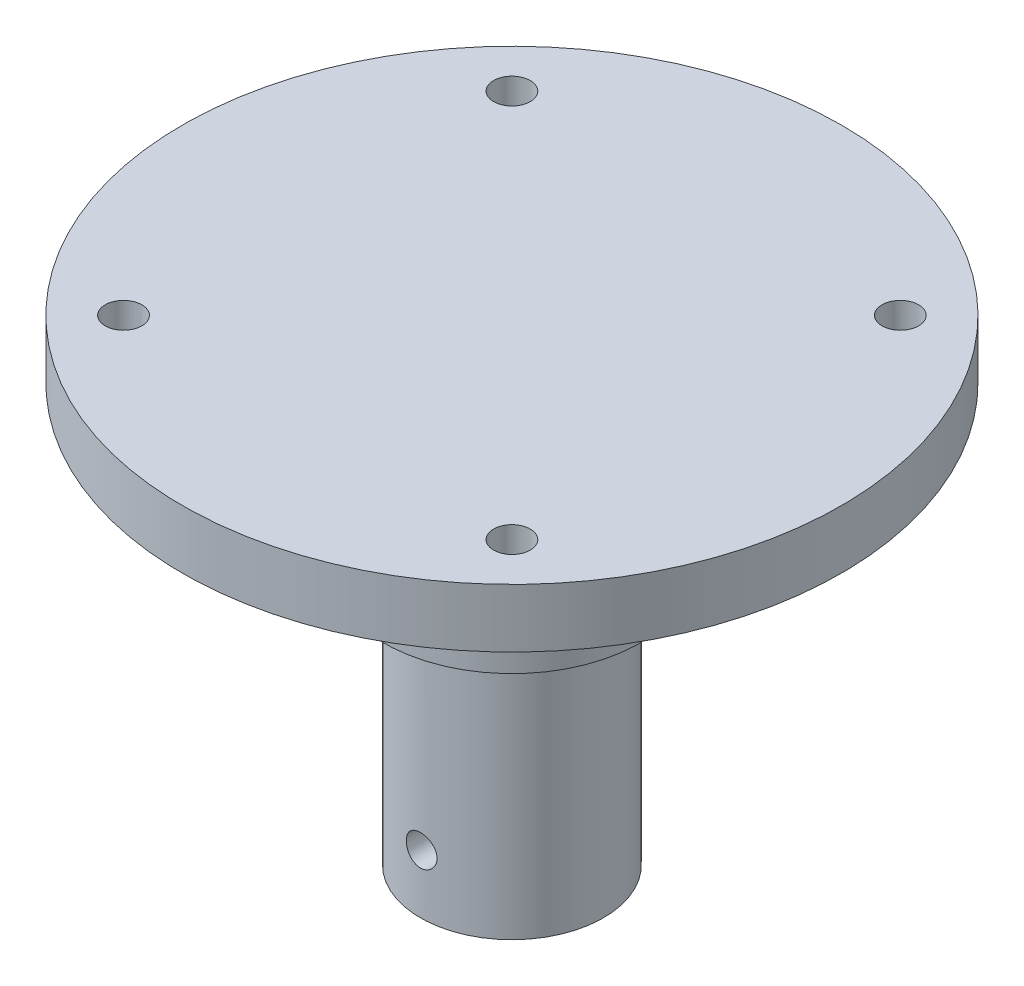
ISO-10303-21;
HEADER;
FILE_DESCRIPTION(('STEP AP214'),'2;1');
FILE_NAME('part.step','',(''),(''),'','','');
FILE_SCHEMA(('AUTOMOTIVE_DESIGN { 1 0 10303 214 1 1 1 1 }'));
ENDSEC;
DATA;
#1=APPLICATION_CONTEXT('core data for automotive mechanical design processes');
#2=APPLICATION_PROTOCOL_DEFINITION('international standard','automotive_design',2000,#1);
#3=PRODUCT_CONTEXT('',#1,'mechanical');
#4=PRODUCT('Part','Part','',(#3));
#5=PRODUCT_RELATED_PRODUCT_CATEGORY('part','',(#4));
#6=PRODUCT_DEFINITION_FORMATION('','',#4);
#7=PRODUCT_DEFINITION_CONTEXT('part definition',#1,'design');
#8=PRODUCT_DEFINITION('design','',#6,#7);
#9=PRODUCT_DEFINITION_SHAPE('','',#8);
#10=(LENGTH_UNIT() NAMED_UNIT(*) SI_UNIT(.MILLI.,.METRE.));
#11=(NAMED_UNIT(*) PLANE_ANGLE_UNIT() SI_UNIT($,.RADIAN.));
#12=(NAMED_UNIT(*) SI_UNIT($,.STERADIAN.) SOLID_ANGLE_UNIT());
#13=UNCERTAINTY_MEASURE_WITH_UNIT(LENGTH_MEASURE(1.E-05),#10,'distance_accuracy_value','');
#14=(GEOMETRIC_REPRESENTATION_CONTEXT(3) GLOBAL_UNCERTAINTY_ASSIGNED_CONTEXT((#13)) GLOBAL_UNIT_ASSIGNED_CONTEXT((#10,
#11,#12)) REPRESENTATION_CONTEXT('',''));
#15=CARTESIAN_POINT('',(0.,0.,0.));
#16=DIRECTION('',(0.,0.,1.));
#17=DIRECTION('',(1.,0.,0.));
#18=AXIS2_PLACEMENT_3D('',#15,#16,#17);
#19=CARTESIAN_POINT('',(0.,0.,0.));
#20=DIRECTION('',(0.,-1.,0.));
#21=DIRECTION('',(0.,0.,-1.));
#22=AXIS2_PLACEMENT_3D('',#19,#20,#21);
#23=CYLINDRICAL_SURFACE('',#22,17.5);
#24=CARTESIAN_POINT('',(0.,57.,0.));
#25=DIRECTION('',(0.,-1.,0.));
#26=DIRECTION('',(0.,0.,-1.));
#27=AXIS2_PLACEMENT_3D('',#24,#25,#26);
#28=CIRCLE('',#27,17.5);
#29=CARTESIAN_POINT('',(0.,57.,-17.5));
#30=VERTEX_POINT('',#29);
#31=EDGE_CURVE('E10',#30,#30,#28,.T.);
#32=ORIENTED_EDGE('',*,*,#31,.T.);
#33=EDGE_LOOP('',(#32));
#34=FACE_BOUND('',#33,.T.);
#35=CARTESIAN_POINT('',(0.,35.,0.));
#36=DIRECTION('',(0.,-1.,0.));
#37=DIRECTION('',(0.,0.,-1.));
#38=AXIS2_PLACEMENT_3D('',#35,#36,#37);
#39=CIRCLE('',#38,17.5);
#40=CARTESIAN_POINT('',(0.,35.,-17.5));
#41=VERTEX_POINT('',#40);
#42=EDGE_CURVE('E167',#41,#41,#39,.T.);
#43=ORIENTED_EDGE('',*,*,#42,.F.);
#44=EDGE_LOOP('',(#43));
#45=FACE_BOUND('',#44,.T.);
#46=ADVANCED_FACE('F30',(#34,#45),#23,.T.);
#47=CARTESIAN_POINT('',(17.5,57.,0.));
#48=DIRECTION('',(0.,-1.,0.));
#49=DIRECTION('',(0.,0.,-1.));
#50=AXIS2_PLACEMENT_3D('',#47,#48,#49);
#51=PLANE('',#50);
#52=CARTESIAN_POINT('',(26.5165042944955,57.,-26.5165042944955));
#53=DIRECTION('',(0.,-1.,0.));
#54=DIRECTION('',(0.,0.,-1.));
#55=AXIS2_PLACEMENT_3D('',#52,#53,#54);
#56=CIRCLE('',#55,2.49999999999999);
#57=CARTESIAN_POINT('',(26.5165042944955,57.,-29.0165042944955));
#58=VERTEX_POINT('',#57);
#59=EDGE_CURVE('E116',#58,#58,#56,.T.);
#60=ORIENTED_EDGE('',*,*,#59,.F.);
#61=EDGE_LOOP('',(#60));
#62=FACE_BOUND('',#61,.T.);
#63=CARTESIAN_POINT('',(-26.5165042944955,57.,26.5165042944955));
#64=DIRECTION('',(0.,-1.,0.));
#65=DIRECTION('',(0.,0.,-1.));
#66=AXIS2_PLACEMENT_3D('',#63,#64,#65);
#67=CIRCLE('',#66,2.49999999999999);
#68=CARTESIAN_POINT('',(-26.5165042944955,57.,24.0165042944955));
#69=VERTEX_POINT('',#68);
#70=EDGE_CURVE('E129',#69,#69,#67,.T.);
#71=ORIENTED_EDGE('',*,*,#70,.F.);
#72=EDGE_LOOP('',(#71));
#73=FACE_BOUND('',#72,.T.);
#74=CARTESIAN_POINT('',(-26.5165042944955,57.,-26.5165042944955));
#75=DIRECTION('',(0.,-1.,0.));
#76=DIRECTION('',(0.,0.,-1.));
#77=AXIS2_PLACEMENT_3D('',#74,#75,#76);
#78=CIRCLE('',#77,2.49999999999999);
#79=CARTESIAN_POINT('',(-26.5165042944955,57.,-29.0165042944955));
#80=VERTEX_POINT('',#79);
#81=EDGE_CURVE('E135',#80,#80,#78,.T.);
#82=ORIENTED_EDGE('',*,*,#81,.F.);
#83=EDGE_LOOP('',(#82));
#84=FACE_BOUND('',#83,.T.);
#85=CARTESIAN_POINT('',(26.5165042944955,57.,26.5165042944955));
#86=DIRECTION('',(0.,-1.,0.));
#87=DIRECTION('',(0.,0.,-1.));
#88=AXIS2_PLACEMENT_3D('',#85,#86,#87);
#89=CIRCLE('',#88,2.49999999999999);
#90=CARTESIAN_POINT('',(26.5165042944955,57.,24.0165042944955));
#91=VERTEX_POINT('',#90);
#92=EDGE_CURVE('E141',#91,#91,#89,.T.);
#93=ORIENTED_EDGE('',*,*,#92,.F.);
#94=EDGE_LOOP('',(#93));
#95=FACE_BOUND('',#94,.T.);
#96=CARTESIAN_POINT('',(0.,57.,0.));
#97=DIRECTION('',(0.,-1.,0.));
#98=DIRECTION('',(0.,0.,-1.));
#99=AXIS2_PLACEMENT_3D('',#96,#97,#98);
#100=CIRCLE('',#99,45.);
#101=CARTESIAN_POINT('',(0.,57.,-45.));
#102=VERTEX_POINT('',#101);
#103=EDGE_CURVE('E42',#102,#102,#100,.T.);
#104=ORIENTED_EDGE('',*,*,#103,.T.);
#105=EDGE_LOOP('',(#104));
#106=FACE_BOUND('',#105,.T.);
#107=ORIENTED_EDGE('',*,*,#31,.F.);
#108=EDGE_LOOP('',(#107));
#109=FACE_BOUND('',#108,.T.);
#110=ADVANCED_FACE('F79',(#62,#73,#84,#95,#106,#109),#51,.T.);
#111=CARTESIAN_POINT('',(0.,0.,0.));
#112=DIRECTION('',(0.,-1.,0.));
#113=DIRECTION('',(0.,0.,-1.));
#114=AXIS2_PLACEMENT_3D('',#111,#112,#113);
#115=CYLINDRICAL_SURFACE('',#114,45.);
#116=CARTESIAN_POINT('',(0.,65.,0.));
#117=DIRECTION('',(0.,-1.,0.));
#118=DIRECTION('',(0.,0.,-1.));
#119=AXIS2_PLACEMENT_3D('',#116,#117,#118);
#120=CIRCLE('',#119,45.);
#121=CARTESIAN_POINT('',(0.,65.,-45.));
#122=VERTEX_POINT('',#121);
#123=EDGE_CURVE('E47',#122,#122,#120,.T.);
#124=ORIENTED_EDGE('',*,*,#123,.T.);
#125=EDGE_LOOP('',(#124));
#126=FACE_BOUND('',#125,.T.);
#127=ORIENTED_EDGE('',*,*,#103,.F.);
#128=EDGE_LOOP('',(#127));
#129=FACE_BOUND('',#128,.T.);
#130=ADVANCED_FACE('F83',(#126,#129),#115,.T.);
#131=CARTESIAN_POINT('',(45.,65.,0.));
#132=DIRECTION('',(0.,1.,0.));
#133=DIRECTION('',(0.,0.,1.));
#134=AXIS2_PLACEMENT_3D('',#131,#132,#133);
#135=PLANE('',#134);
#136=CARTESIAN_POINT('',(26.5165042944955,65.,-26.5165042944955));
#137=DIRECTION('',(0.,1.,0.));
#138=DIRECTION('',(0.,0.,1.));
#139=AXIS2_PLACEMENT_3D('',#136,#137,#138);
#140=CIRCLE('',#139,2.49999999999999);
#141=CARTESIAN_POINT('',(26.5165042944955,65.,-24.0165042944955));
#142=VERTEX_POINT('',#141);
#143=EDGE_CURVE('E119',#142,#142,#140,.T.);
#144=ORIENTED_EDGE('',*,*,#143,.F.);
#145=EDGE_LOOP('',(#144));
#146=FACE_BOUND('',#145,.T.);
#147=CARTESIAN_POINT('',(-26.5165042944955,65.,26.5165042944955));
#148=DIRECTION('',(0.,1.,0.));
#149=DIRECTION('',(0.,0.,1.));
#150=AXIS2_PLACEMENT_3D('',#147,#148,#149);
#151=CIRCLE('',#150,2.49999999999999);
#152=CARTESIAN_POINT('',(-26.5165042944955,65.,29.0165042944955));
#153=VERTEX_POINT('',#152);
#154=EDGE_CURVE('E122',#153,#153,#151,.T.);
#155=ORIENTED_EDGE('',*,*,#154,.F.);
#156=EDGE_LOOP('',(#155));
#157=FACE_BOUND('',#156,.T.);
#158=CARTESIAN_POINT('',(-26.5165042944955,65.,-26.5165042944955));
#159=DIRECTION('',(0.,1.,0.));
#160=DIRECTION('',(0.,0.,1.));
#161=AXIS2_PLACEMENT_3D('',#158,#159,#160);
#162=CIRCLE('',#161,2.49999999999999);
#163=CARTESIAN_POINT('',(-26.5165042944955,65.,-24.0165042944955));
#164=VERTEX_POINT('',#163);
#165=EDGE_CURVE('E132',#164,#164,#162,.T.);
#166=ORIENTED_EDGE('',*,*,#165,.F.);
#167=EDGE_LOOP('',(#166));
#168=FACE_BOUND('',#167,.T.);
#169=CARTESIAN_POINT('',(26.5165042944955,65.,26.5165042944955));
#170=DIRECTION('',(0.,1.,0.));
#171=DIRECTION('',(0.,0.,1.));
#172=AXIS2_PLACEMENT_3D('',#169,#170,#171);
#173=CIRCLE('',#172,2.49999999999999);
#174=CARTESIAN_POINT('',(26.5165042944955,65.,29.0165042944955));
#175=VERTEX_POINT('',#174);
#176=EDGE_CURVE('E138',#175,#175,#173,.T.);
#177=ORIENTED_EDGE('',*,*,#176,.F.);
#178=EDGE_LOOP('',(#177));
#179=FACE_BOUND('',#178,.T.);
#180=ORIENTED_EDGE('',*,*,#123,.F.);
#181=EDGE_LOOP('',(#180));
#182=FACE_BOUND('',#181,.T.);
#183=ADVANCED_FACE('F90',(#146,#157,#168,#179,#182),#135,.T.);
#184=CARTESIAN_POINT('',(26.5165042944955,65.,26.5165042944955));
#185=DIRECTION('',(0.,1.,0.));
#186=DIRECTION('',(0.,0.,1.));
#187=AXIS2_PLACEMENT_3D('',#184,#185,#186);
#188=CYLINDRICAL_SURFACE('',#187,2.49999999999999);
#189=ORIENTED_EDGE('',*,*,#92,.T.);
#190=EDGE_LOOP('',(#189));
#191=FACE_BOUND('',#190,.T.);
#192=ORIENTED_EDGE('',*,*,#176,.T.);
#193=EDGE_LOOP('',(#192));
#194=FACE_BOUND('',#193,.T.);
#195=ADVANCED_FACE('F94',(#191,#194),#188,.F.);
#196=CARTESIAN_POINT('',(-26.5165042944955,65.,-26.5165042944955));
#197=DIRECTION('',(0.,1.,0.));
#198=DIRECTION('',(0.,0.,1.));
#199=AXIS2_PLACEMENT_3D('',#196,#197,#198);
#200=CYLINDRICAL_SURFACE('',#199,2.49999999999999);
#201=ORIENTED_EDGE('',*,*,#81,.T.);
#202=EDGE_LOOP('',(#201));
#203=FACE_BOUND('',#202,.T.);
#204=ORIENTED_EDGE('',*,*,#165,.T.);
#205=EDGE_LOOP('',(#204));
#206=FACE_BOUND('',#205,.T.);
#207=ADVANCED_FACE('F98',(#203,#206),#200,.F.);
#208=CARTESIAN_POINT('',(-26.5165042944955,65.,26.5165042944955));
#209=DIRECTION('',(0.,1.,0.));
#210=DIRECTION('',(0.,0.,1.));
#211=AXIS2_PLACEMENT_3D('',#208,#209,#210);
#212=CYLINDRICAL_SURFACE('',#211,2.49999999999999);
#213=ORIENTED_EDGE('',*,*,#70,.T.);
#214=EDGE_LOOP('',(#213));
#215=FACE_BOUND('',#214,.T.);
#216=ORIENTED_EDGE('',*,*,#154,.T.);
#217=EDGE_LOOP('',(#216));
#218=FACE_BOUND('',#217,.T.);
#219=ADVANCED_FACE('F102',(#215,#218),#212,.F.);
#220=CARTESIAN_POINT('',(26.5165042944955,65.,-26.5165042944955));
#221=DIRECTION('',(0.,1.,0.));
#222=DIRECTION('',(0.,0.,1.));
#223=AXIS2_PLACEMENT_3D('',#220,#221,#222);
#224=CYLINDRICAL_SURFACE('',#223,2.49999999999999);
#225=ORIENTED_EDGE('',*,*,#59,.T.);
#226=EDGE_LOOP('',(#225));
#227=FACE_BOUND('',#226,.T.);
#228=ORIENTED_EDGE('',*,*,#143,.T.);
#229=EDGE_LOOP('',(#228));
#230=FACE_BOUND('',#229,.T.);
#231=ADVANCED_FACE('F105',(#227,#230),#224,.F.);
#232=CARTESIAN_POINT('',(0.,35.,0.));
#233=DIRECTION('',(0.,-1.,0.));
#234=DIRECTION('',(0.,0.,-1.));
#235=AXIS2_PLACEMENT_3D('',#232,#233,#234);
#236=CYLINDRICAL_SURFACE('',#235,12.5);
#237=CARTESIAN_POINT('',(0.,35.,0.));
#238=DIRECTION('',(0.,-1.,0.));
#239=DIRECTION('',(0.,0.,-1.));
#240=AXIS2_PLACEMENT_3D('',#237,#238,#239);
#241=CIRCLE('',#240,12.5);
#242=CARTESIAN_POINT('',(0.,35.,-12.5));
#243=VERTEX_POINT('',#242);
#244=EDGE_CURVE('E170',#243,#243,#241,.T.);
#245=ORIENTED_EDGE('',*,*,#244,.T.);
#246=EDGE_LOOP('',(#245));
#247=FACE_BOUND('',#246,.T.);
#248=CARTESIAN_POINT('',(0.,0.,0.));
#249=DIRECTION('',(0.,-1.,0.));
#250=DIRECTION('',(0.,0.,-1.));
#251=AXIS2_PLACEMENT_3D('',#248,#249,#250);
#252=CIRCLE('',#251,12.5);
#253=CARTESIAN_POINT('',(0.,0.,-12.5));
#254=VERTEX_POINT('',#253);
#255=EDGE_CURVE('E171',#254,#254,#252,.T.);
#256=ORIENTED_EDGE('',*,*,#255,.F.);
#257=EDGE_LOOP('',(#256));
#258=FACE_BOUND('',#257,.T.);
#259=CARTESIAN_POINT('',(-2.1,8.,12.3223374405995));
#260=CARTESIAN_POINT('',(-2.09999530712857,8.11706139847949,12.3223395650367));
#261=CARTESIAN_POINT('',(-2.09017872592953,8.2341863798609,12.3240236342084));
#262=CARTESIAN_POINT('',(-2.05118940750232,8.46514903241884,12.3305716769245));
#263=CARTESIAN_POINT('',(-2.02199890673147,8.57898358662184,12.3354385686725));
#264=CARTESIAN_POINT('',(-1.94517053187237,8.79998945915861,12.3477858289215));
#265=CARTESIAN_POINT('',(-1.89754818175194,8.9071662969402,12.3552639975939));
#266=CARTESIAN_POINT('',(-1.78524674613213,9.11199727209984,12.3719886100909));
#267=CARTESIAN_POINT('',(-1.72056954414086,9.20965245940209,12.3812348586209));
#268=CARTESIAN_POINT('',(-1.57530351952462,9.39365732336604,12.4005572659454));
#269=CARTESIAN_POINT('',(-1.49457727212389,9.47989781933382,12.4106401206403));
#270=CARTESIAN_POINT('',(-1.31980166164295,9.6376767535172,12.4304401945053));
#271=CARTESIAN_POINT('',(-1.22575150451584,9.70921431487887,12.4401573918401));
#272=CARTESIAN_POINT('',(-1.02628979622167,9.83596698770096,12.4582021958376));
#273=CARTESIAN_POINT('',(-0.920812758368821,9.89108040578945,12.4665210113829));
#274=CARTESIAN_POINT('',(-0.701934758227069,9.98276658366494,12.4807572069388));
#275=CARTESIAN_POINT('',(-0.588534319920948,10.0193405681662,12.4866747455726));
#276=CARTESIAN_POINT('',(-0.358156739240033,10.072575520882,12.4953943706673));
#277=CARTESIAN_POINT('',(-0.241223099214209,10.0894199723059,12.4982251464575));
#278=CARTESIAN_POINT('',(-0.00615732912204097,10.1032883318735,12.5005508820687));
#279=CARTESIAN_POINT('',(0.111974717670046,10.1003136079088,12.5000460721071));
#280=CARTESIAN_POINT('',(0.344829212766613,10.0747710060593,12.4957802077193));
#281=CARTESIAN_POINT('',(0.45957400948303,10.0524005980241,12.4920519724506));
#282=CARTESIAN_POINT('',(0.683657725899589,9.98901266954719,12.4817947717205));
#283=CARTESIAN_POINT('',(0.792996478775861,9.94799457405855,12.4752657198895));
#284=CARTESIAN_POINT('',(1.00375076643002,9.84827986770816,12.460084682479));
#285=CARTESIAN_POINT('',(1.10512714450859,9.78950203626583,12.4514229780687));
#286=CARTESIAN_POINT('',(1.29665223163887,9.65599587096096,12.4329386941724));
#287=CARTESIAN_POINT('',(1.38680001677374,9.58126622591422,12.4231160192883));
#288=CARTESIAN_POINT('',(1.55447585819368,9.41688291402221,12.4032590212249));
#289=CARTESIAN_POINT('',(1.63183466644083,9.32705664642597,12.3932235816326));
#290=CARTESIAN_POINT('',(1.77040983518762,9.13561108413362,12.3741891286412));
#291=CARTESIAN_POINT('',(1.83162604210974,9.03399167725317,12.3651901251031));
#292=CARTESIAN_POINT('',(1.93621248583404,8.82164644535532,12.3492468068517));
#293=CARTESIAN_POINT('',(1.97956208877491,8.71091026753202,12.3423048703977));
#294=CARTESIAN_POINT('',(2.04699732452101,8.48358514548419,12.3313008514754));
#295=CARTESIAN_POINT('',(2.07108468251577,8.36699672639973,12.3272385111049));
#296=CARTESIAN_POINT('',(2.09907282104123,8.13279167801634,12.3225036043167));
#297=CARTESIAN_POINT('',(2.10321498134418,8.01520468731475,12.3217905074651));
#298=CARTESIAN_POINT('',(2.09183861336605,7.78101764565068,12.3237268410071));
#299=CARTESIAN_POINT('',(2.07632085720624,7.66441755610981,12.3263761393465));
#300=CARTESIAN_POINT('',(2.02627103609545,7.43628254934819,12.3347012885269));
#301=CARTESIAN_POINT('',(1.99186205922477,7.32471984966109,12.3403575397118));
#302=CARTESIAN_POINT('',(1.90513572637029,7.10894421596061,12.3540428027724));
#303=CARTESIAN_POINT('',(1.85281728361786,7.00473172843018,12.362071958635));
#304=CARTESIAN_POINT('',(1.73118831712496,6.80554111043399,12.3796924068664));
#305=CARTESIAN_POINT('',(1.66172324435857,6.71065860416266,12.3892976250501));
#306=CARTESIAN_POINT('',(1.50798477365039,6.53381039785657,12.4089472944051));
#307=CARTESIAN_POINT('',(1.42371031675844,6.45184562230417,12.4189917769475));
#308=CARTESIAN_POINT('',(1.24167537367212,6.30227689699609,12.4385165395491));
#309=CARTESIAN_POINT('',(1.1437816780725,6.23483400542594,12.447989728618));
#310=CARTESIAN_POINT('',(0.937913341098333,6.11735214964424,12.4651904347497));
#311=CARTESIAN_POINT('',(0.829939029987766,6.06731261551258,12.4729180089745));
#312=CARTESIAN_POINT('',(0.607450886419188,5.98630796577563,12.4857259960798));
#313=CARTESIAN_POINT('',(0.492968323022445,5.95525888533505,12.4908180461255));
#314=CARTESIAN_POINT('',(0.260321202595992,5.91284628407858,12.4978304746155));
#315=CARTESIAN_POINT('',(0.142156954448745,5.90148111634354,12.4997511184054));
#316=CARTESIAN_POINT('',(-0.0929453860710271,5.89880695297193,12.500200486709));
#317=CARTESIAN_POINT('',(-0.2098806854464,5.90725301357962,12.4987706365668));
#318=CARTESIAN_POINT('',(-0.440641970697272,5.94343134720361,12.4927643357866));
#319=CARTESIAN_POINT('',(-0.554467974665941,5.97116350796812,12.4881879034629));
#320=CARTESIAN_POINT('',(-0.775683838548143,6.04503225889227,12.4764009404282));
#321=CARTESIAN_POINT('',(-0.88308093148998,6.09114770112676,12.4691934372722));
#322=CARTESIAN_POINT('',(-1.08865103993481,6.20044657227529,12.4529307306021));
#323=CARTESIAN_POINT('',(-1.18682360653785,6.2636308312426,12.4438754372356));
#324=CARTESIAN_POINT('',(-1.37239100346253,6.40614058613859,12.4247880181135));
#325=CARTESIAN_POINT('',(-1.45964716598265,6.4856453082066,12.4147457539949));
#326=CARTESIAN_POINT('',(-1.61966614181785,6.65816324991655,12.3948860361185));
#327=CARTESIAN_POINT('',(-1.69242555554045,6.75117962931799,12.3850686355695));
#328=CARTESIAN_POINT('',(-1.82186777090044,6.94887620155249,12.3666937830266));
#329=CARTESIAN_POINT('',(-1.87843104003113,7.05363555733043,12.3581459123372));
#330=CARTESIAN_POINT('',(-1.97306995044576,7.27127036675145,12.3433912883743));
#331=CARTESIAN_POINT('',(-2.01116399963654,7.38413761003004,12.3371822054603));
#332=CARTESIAN_POINT('',(-2.05954195240914,7.58119851261335,12.3291802266139));
#333=CARTESIAN_POINT('',(-2.07468927935581,7.6642012225838,12.3266285081024));
#334=CARTESIAN_POINT('',(-2.09491989885204,7.83145831600494,12.323206365939));
#335=CARTESIAN_POINT('',(-2.10000337899238,7.91571267609529,12.3223359109481));
#336=CARTESIAN_POINT('',(-2.1,8.,12.3223374405995));
#337=B_SPLINE_CURVE_WITH_KNOTS('',3,(#259,#260,#261,#262,#263,#264,#265,#266,#267,#268,#269,
#270,#271,#272,#273,#274,#275,#276,#277,#278,#279,#280,#281,#282,#283,#284,#285,#286,#287,#288,
#289,#290,#291,#292,#293,#294,#295,#296,#297,#298,#299,#300,#301,#302,#303,#304,#305,#306,#307,
#308,#309,#310,#311,#312,#313,#314,#315,#316,#317,#318,#319,#320,#321,#322,#323,#324,#325,#326,
#327,#328,#329,#330,#331,#332,#333,#334,#335,#336),.UNSPECIFIED.,.T.,.F.,(4,2,2,2,2,2,2,2,2,2,2,
2,2,2,2,2,2,2,2,2,2,2,2,2,2,2,2,2,2,2,2,2,2,2,2,2,2,2,4),(0.,0.350875958145452,
0.702074072387611,1.05297703633845,1.40384126339608,1.75785040037217,2.11188064363101,
2.46805944490096,2.82421471394629,3.17703078298166,3.52982250139846,3.87906402811643,
4.22831632528105,4.57919067492618,4.93009387634908,5.28532233621945,5.64055417554105,
5.99619512469852,6.35180421792334,6.70309867118227,7.05437932817151,7.4033978775084,
7.75243760948004,8.10474624423454,8.45708008119898,8.81314042381343,9.16918910516888,
9.52365194445035,9.87808512500236,10.2281592743139,10.5782313860894,10.927901935583,
11.2775894925505,11.6313450994484,11.9851835672062,12.3415698589654,12.6976002135917,
12.950244955607,13.2028849882627),.UNSPECIFIED.);
#338=CARTESIAN_POINT('',(-2.1,8.,12.3223374405995));
#339=VERTEX_POINT('',#338);
#340=EDGE_CURVE('E34',#339,#339,#337,.T.);
#341=ORIENTED_EDGE('',*,*,#340,.T.);
#342=EDGE_LOOP('',(#341));
#343=FACE_BOUND('',#342,.T.);
#344=ADVANCED_FACE('F75',(#247,#258,#343),#236,.T.);
#345=CARTESIAN_POINT('',(0.,35.,0.));
#346=DIRECTION('',(0.,-1.,0.));
#347=DIRECTION('',(0.,0.,-1.));
#348=AXIS2_PLACEMENT_3D('',#345,#346,#347);
#349=PLANE('',#348);
#350=ORIENTED_EDGE('',*,*,#244,.F.);
#351=EDGE_LOOP('',(#350));
#352=FACE_BOUND('',#351,.T.);
#353=ORIENTED_EDGE('',*,*,#42,.T.);
#354=EDGE_LOOP('',(#353));
#355=FACE_BOUND('',#354,.T.);
#356=ADVANCED_FACE('F65',(#352,#355),#349,.T.);
#357=CARTESIAN_POINT('',(0.,18.,0.));
#358=DIRECTION('',(0.,-1.,0.));
#359=DIRECTION('',(0.,0.,-1.));
#360=AXIS2_PLACEMENT_3D('',#357,#358,#359);
#361=PLANE('',#360);
#362=CARTESIAN_POINT('',(0.,18.,0.));
#363=DIRECTION('',(0.,-1.,0.));
#364=DIRECTION('',(0.,0.,-1.));
#365=AXIS2_PLACEMENT_3D('',#362,#363,#364);
#366=CIRCLE('',#365,3.1);
#367=CARTESIAN_POINT('',(0.,18.,-3.1));
#368=VERTEX_POINT('',#367);
#369=EDGE_CURVE('E120',#368,#368,#366,.T.);
#370=ORIENTED_EDGE('',*,*,#369,.T.);
#371=EDGE_LOOP('',(#370));
#372=FACE_BOUND('',#371,.T.);
#373=ADVANCED_FACE('F66',(#372),#361,.T.);
#374=CARTESIAN_POINT('',(0.,0.,0.));
#375=DIRECTION('',(0.,-1.,0.));
#376=DIRECTION('',(0.,0.,-1.));
#377=AXIS2_PLACEMENT_3D('',#374,#375,#376);
#378=PLANE('',#377);
#379=CARTESIAN_POINT('',(0.,0.,0.));
#380=DIRECTION('',(0.,-1.,0.));
#381=DIRECTION('',(0.,0.,-1.));
#382=AXIS2_PLACEMENT_3D('',#379,#380,#381);
#383=CIRCLE('',#382,3.1);
#384=CARTESIAN_POINT('',(0.,0.,-3.1));
#385=VERTEX_POINT('',#384);
#386=EDGE_CURVE('E55',#385,#385,#383,.T.);
#387=ORIENTED_EDGE('',*,*,#386,.F.);
#388=EDGE_LOOP('',(#387));
#389=FACE_BOUND('',#388,.T.);
#390=ORIENTED_EDGE('',*,*,#255,.T.);
#391=EDGE_LOOP('',(#390));
#392=FACE_BOUND('',#391,.T.);
#393=ADVANCED_FACE('F32',(#389,#392),#378,.T.);
#394=CARTESIAN_POINT('',(0.,18.,0.));
#395=DIRECTION('',(0.,-1.,0.));
#396=DIRECTION('',(0.,0.,-1.));
#397=AXIS2_PLACEMENT_3D('',#394,#395,#396);
#398=CYLINDRICAL_SURFACE('',#397,3.1);
#399=CARTESIAN_POINT('',(-2.1,8.,2.28035085019828));
#400=CARTESIAN_POINT('',(-2.09999642838992,7.8980192684126,2.28035734030977));
#401=CARTESIAN_POINT('',(-2.09250708768734,7.79601848439838,2.28732005307692));
#402=CARTESIAN_POINT('',(-2.06321242902849,7.59570900054165,2.31376625210837));
#403=CARTESIAN_POINT('',(-2.04138065582472,7.49740747910496,2.33327287475723));
#404=CARTESIAN_POINT('',(-1.98516494043957,7.30805027171493,2.38127175306863));
#405=CARTESIAN_POINT('',(-1.95090816196376,7.21693217772112,2.40967259236126));
#406=CARTESIAN_POINT('',(-1.87117793076405,7.04190214867041,2.47209531478814));
#407=CARTESIAN_POINT('',(-1.82570259588194,6.9579914259957,2.50611814081705));
#408=CARTESIAN_POINT('',(-1.71628675982681,6.78489834250043,2.5825367875316));
#409=CARTESIAN_POINT('',(-1.65054964093457,6.69705662570415,2.62539704296698));
#410=CARTESIAN_POINT('',(-1.50610449957015,6.53246784631849,2.7108502028654));
#411=CARTESIAN_POINT('',(-1.42738194940031,6.4557333927959,2.75344275178498));
#412=CARTESIAN_POINT('',(-1.24484229158047,6.30397409738294,2.84114562262324));
#413=CARTESIAN_POINT('',(-1.13903018689915,6.23097011878309,2.88565953063688));
#414=CARTESIAN_POINT('',(-0.913065960702199,6.10448329318349,2.96488759622648));
#415=CARTESIAN_POINT('',(-0.792940983448517,6.05096425127452,2.99961989648937));
#416=CARTESIAN_POINT('',(-0.573954205365669,5.97754674232797,3.0479127548267));
#417=CARTESIAN_POINT('',(-0.47747978169879,5.95255536379712,3.06461349751538));
#418=CARTESIAN_POINT('',(-0.280857789973691,5.91647330228784,3.08883465536867));
#419=CARTESIAN_POINT('',(-0.180713092252299,5.90537198567302,3.09636209310756));
#420=CARTESIAN_POINT('',(0.0205598107242889,5.89768258214143,3.10156909090698));
#421=CARTESIAN_POINT('',(0.121689380686311,5.90111879787895,3.09923216054075));
#422=CARTESIAN_POINT('',(0.321733435486471,5.92235439033189,3.08489075308606));
#423=CARTESIAN_POINT('',(0.420647260736535,5.94015798706866,3.07288343559055));
#424=CARTESIAN_POINT('',(0.611811208538974,5.98872025500189,3.04054703956397));
#425=CARTESIAN_POINT('',(0.70414932770274,6.01923953643574,3.02037192000266));
#426=CARTESIAN_POINT('',(0.882244920608958,6.09188488149494,2.97323745109886));
#427=CARTESIAN_POINT('',(0.968001141651982,6.13401314763053,2.9462768144609));
#428=CARTESIAN_POINT('',(1.14098005195774,6.23386449818712,2.88401428017491));
#429=CARTESIAN_POINT('',(1.22727837877472,6.29281017825225,2.84811470421114));
#430=CARTESIAN_POINT('',(1.38935067285124,6.42188124509567,2.7726728245412));
#431=CARTESIAN_POINT('',(1.46511224426464,6.4920195945975,2.73312631986091));
#432=CARTESIAN_POINT('',(1.61722102759705,6.65499512650484,2.64640916296825));
#433=CARTESIAN_POINT('',(1.69151912453531,6.74966579758963,2.59907591442152));
#434=CARTESIAN_POINT('',(1.82356342609342,6.95159657496229,2.50819289288311));
#435=CARTESIAN_POINT('',(1.88131898970199,7.05884951418401,2.46464099034181));
#436=CARTESIAN_POINT('',(1.96677504873541,7.25799009093992,2.3966734922441));
#437=CARTESIAN_POINT('',(1.99835499507838,7.34748873730325,2.37016912670099));
#438=CARTESIAN_POINT('',(2.04940107540779,7.53194404200682,2.32617740562908));
#439=CARTESIAN_POINT('',(2.06888931942794,7.62689038954954,2.30867360240763));
#440=CARTESIAN_POINT('',(2.09464403495317,7.82085033438819,2.28534320130258));
#441=CARTESIAN_POINT('',(2.10080237918838,7.91989060066601,2.27961211834667));
#442=CARTESIAN_POINT('',(2.09902903624843,8.11774026191087,2.28124482765277));
#443=CARTESIAN_POINT('',(2.09109688875852,8.21654964922987,2.28860904771825));
#444=CARTESIAN_POINT('',(2.06346862117243,8.39964624512195,2.31352054732848));
#445=CARTESIAN_POINT('',(2.04517716532292,8.48432736430728,2.32984578419673));
#446=CARTESIAN_POINT('',(1.99895050995357,8.64926487458932,2.36962560782582));
#447=CARTESIAN_POINT('',(1.97100648459206,8.72951713799907,2.3930867169287));
#448=CARTESIAN_POINT('',(1.89180326886528,8.91976926108331,2.45655609013071));
#449=CARTESIAN_POINT('',(1.8357127349081,9.02686295378917,2.4992552225474));
#450=CARTESIAN_POINT('',(1.70712548560962,9.2288625313294,2.58879915977395));
#451=CARTESIAN_POINT('',(1.63459847644429,9.3237453978033,2.63565152101349));
#452=CARTESIAN_POINT('',(1.47323902587501,9.50138263731005,2.7291735324597));
#453=CARTESIAN_POINT('',(1.38419713191757,9.58395336975154,2.7758319184785));
#454=CARTESIAN_POINT('',(1.19161631639651,9.73345302753266,2.86377668355456));
#455=CARTESIAN_POINT('',(1.088100797583,9.80040674711728,2.90507153115509));
#456=CARTESIAN_POINT('',(0.887761131825918,9.90586555056512,2.97169516106796));
#457=CARTESIAN_POINT('',(0.792997442794312,9.94730873373608,2.99855629116616));
#458=CARTESIAN_POINT('',(0.596557779022464,10.0161665483838,3.04372277537631));
#459=CARTESIAN_POINT('',(0.494886286587689,10.0435901801558,3.06203361796065));
#460=CARTESIAN_POINT('',(0.28675900474207,10.0830344469868,3.0884973176877));
#461=CARTESIAN_POINT('',(0.180282867575403,10.0949816421643,3.09660173757495));
#462=CARTESIAN_POINT('',(-0.0335080708302389,10.1024529508251,3.10166069340483));
#463=CARTESIAN_POINT('',(-0.140822702599915,10.0979803014337,3.09861742708208));
#464=CARTESIAN_POINT('',(-0.344176359424192,10.0739311522712,3.08238926161201));
#465=CARTESIAN_POINT('',(-0.440432837586759,10.055585591842,3.07003114307885));
#466=CARTESIAN_POINT('',(-0.628152268523083,10.0062029148382,3.03718801733982));
#467=CARTESIAN_POINT('',(-0.719614455721523,9.9751637782158,3.01670171663557));
#468=CARTESIAN_POINT('',(-0.900516717240974,9.89978139895956,2.96787829644153));
#469=CARTESIAN_POINT('',(-0.989606909993277,9.85483253385105,2.93918961318396));
#470=CARTESIAN_POINT('',(-1.15921185440022,9.75384837911888,2.87652856538772));
#471=CARTESIAN_POINT('',(-1.23972194869751,9.69780711511785,2.84255335563882));
#472=CARTESIAN_POINT('',(-1.40338477706803,9.5662739909623,2.7658475215703));
#473=CARTESIAN_POINT('',(-1.48494037946048,9.48910758570447,2.72258211839644));
#474=CARTESIAN_POINT('',(-1.63470581887055,9.32297484892847,2.63538462316186));
#475=CARTESIAN_POINT('',(-1.70290409234451,9.23399840416826,2.59145198861194));
#476=CARTESIAN_POINT('',(-1.82179781194197,9.04996943817475,2.5091843521616));
#477=CARTESIAN_POINT('',(-1.87320822236499,8.95545779920904,2.47067817116285));
#478=CARTESIAN_POINT('',(-1.96164154090682,8.75741330548861,2.40106969398321));
#479=CARTESIAN_POINT('',(-1.99868839254875,8.65389581900859,2.36995511011461));
#480=CARTESIAN_POINT('',(-2.05121963408473,8.45905439650177,2.32454031640723));
#481=CARTESIAN_POINT('',(-2.06940306799748,8.36894588840712,2.30820929635668));
#482=CARTESIAN_POINT('',(-2.09378706882798,8.18589456990201,2.28611849498714));
#483=CARTESIAN_POINT('',(-2.10000325552882,8.0929556150844,2.28034493445031));
#484=CARTESIAN_POINT('',(-2.1,8.,2.28035085019828));
#485=B_SPLINE_CURVE_WITH_KNOTS('',3,(#399,#400,#401,#402,#403,#404,#405,#406,#407,#408,#409,
#410,#411,#412,#413,#414,#415,#416,#417,#418,#419,#420,#421,#422,#423,#424,#425,#426,#427,#428,
#429,#430,#431,#432,#433,#434,#435,#436,#437,#438,#439,#440,#441,#442,#443,#444,#445,#446,#447,
#448,#449,#450,#451,#452,#453,#454,#455,#456,#457,#458,#459,#460,#461,#462,#463,#464,#465,#466,
#467,#468,#469,#470,#471,#472,#473,#474,#475,#476,#477,#478,#479,#480,#481,#482,#483,#484),
.UNSPECIFIED.,.T.,.F.,(4,2,2,2,2,2,2,2,2,2,2,2,2,2,2,2,2,2,2,2,2,2,2,2,2,2,2,2,2,2,2,2,2,2,2,2,
2,2,2,2,2,2,4),(0.,0.305514985402862,0.611595094881761,0.914627156585825,1.21771009316257,
1.56978855683386,1.92226362029188,2.32814753432192,2.73327359084863,3.03510910982955,
3.33671341480244,3.6388221161699,3.94101958593559,4.23776794279316,4.53457263892984,
4.86483418185315,5.19548102883322,5.58179882748157,5.96789763198732,6.26242273123409,
6.5564076831642,6.85276853367604,7.14913906602025,7.4125876804211,7.6762778199019,
8.0588856707661,8.44220451975461,8.83076629051459,9.2187068997705,9.53795880321575,
9.85700549459515,10.1775606689958,10.4980526502575,10.7930267132672,11.0880477365446,
11.3983436916258,11.7088072294402,12.0683895234574,12.4282817479368,12.7698295741834,
13.1108055794411,13.3896472172026,13.6681246603781),.UNSPECIFIED.);
#486=CARTESIAN_POINT('',(-2.1,8.,2.28035085019828));
#487=VERTEX_POINT('',#486);
#488=EDGE_CURVE('E50',#487,#487,#485,.T.);
#489=ORIENTED_EDGE('',*,*,#488,.T.);
#490=EDGE_LOOP('',(#489));
#491=FACE_BOUND('',#490,.T.);
#492=ORIENTED_EDGE('',*,*,#369,.F.);
#493=EDGE_LOOP('',(#492));
#494=FACE_BOUND('',#493,.T.);
#495=ORIENTED_EDGE('',*,*,#386,.T.);
#496=EDGE_LOOP('',(#495));
#497=FACE_BOUND('',#496,.T.);
#498=ADVANCED_FACE('F56',(#491,#494,#497),#398,.F.);
#499=CARTESIAN_POINT('',(0.,8.,0.));
#500=DIRECTION('',(0.,0.,-1.));
#501=DIRECTION('',(-1.,0.,0.));
#502=AXIS2_PLACEMENT_3D('',#499,#500,#501);
#503=CYLINDRICAL_SURFACE('',#502,2.1);
#504=ORIENTED_EDGE('',*,*,#488,.F.);
#505=EDGE_LOOP('',(#504));
#506=FACE_BOUND('',#505,.T.);
#507=ORIENTED_EDGE('',*,*,#340,.F.);
#508=EDGE_LOOP('',(#507));
#509=FACE_BOUND('',#508,.T.);
#510=ADVANCED_FACE('F60',(#506,#509),#503,.F.);
#511=CLOSED_SHELL('',(#46,#110,#130,#183,#195,#207,#219,#231,#344,#356,#373,#393,#498,#510));
#512=MANIFOLD_SOLID_BREP('B2',#511);
#513=ADVANCED_BREP_SHAPE_REPRESENTATION('',(#18,#512),#14);
#514=SHAPE_DEFINITION_REPRESENTATION(#9,#513);
ENDSEC;
END-ISO-10303-21;
